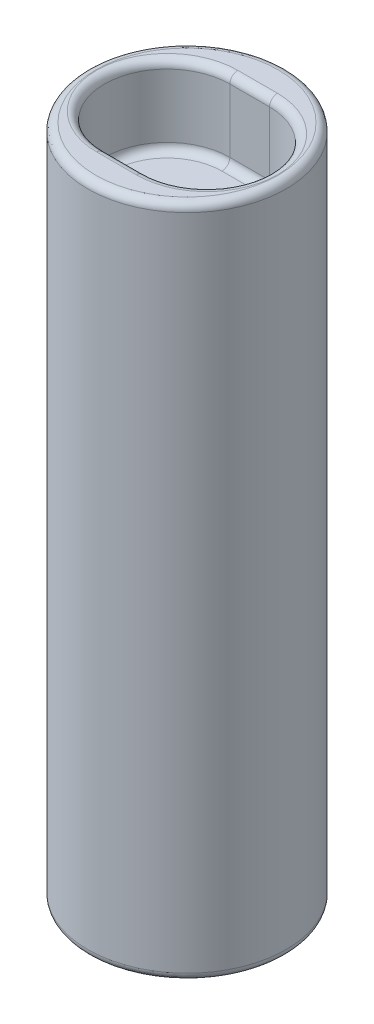
ISO-10303-21;
HEADER;
FILE_DESCRIPTION(('STEP AP214'),'2;1');
FILE_NAME('part.step','',(''),(''),'','','');
FILE_SCHEMA(('AUTOMOTIVE_DESIGN { 1 0 10303 214 1 1 1 1 }'));
ENDSEC;
DATA;
#1=APPLICATION_CONTEXT('core data for automotive mechanical design processes');
#2=APPLICATION_PROTOCOL_DEFINITION('international standard','automotive_design',2000,#1);
#3=PRODUCT_CONTEXT('',#1,'mechanical');
#4=PRODUCT('Part','Part','',(#3));
#5=PRODUCT_RELATED_PRODUCT_CATEGORY('part','',(#4));
#6=PRODUCT_DEFINITION_FORMATION('','',#4);
#7=PRODUCT_DEFINITION_CONTEXT('part definition',#1,'design');
#8=PRODUCT_DEFINITION('design','',#6,#7);
#9=PRODUCT_DEFINITION_SHAPE('','',#8);
#10=(LENGTH_UNIT() NAMED_UNIT(*) SI_UNIT(.MILLI.,.METRE.));
#11=(NAMED_UNIT(*) PLANE_ANGLE_UNIT() SI_UNIT($,.RADIAN.));
#12=(NAMED_UNIT(*) SI_UNIT($,.STERADIAN.) SOLID_ANGLE_UNIT());
#13=UNCERTAINTY_MEASURE_WITH_UNIT(LENGTH_MEASURE(1.E-05),#10,'distance_accuracy_value','');
#14=(GEOMETRIC_REPRESENTATION_CONTEXT(3) GLOBAL_UNCERTAINTY_ASSIGNED_CONTEXT((#13)) GLOBAL_UNIT_ASSIGNED_CONTEXT((#10,
#11,#12)) REPRESENTATION_CONTEXT('',''));
#15=CARTESIAN_POINT('',(0.,0.,0.));
#16=DIRECTION('',(0.,0.,1.));
#17=DIRECTION('',(1.,0.,0.));
#18=AXIS2_PLACEMENT_3D('',#15,#16,#17);
#19=CARTESIAN_POINT('',(-1.27,5.08,0.));
#20=DIRECTION('',(0.,-1.,0.));
#21=DIRECTION('',(0.,0.,-1.));
#22=AXIS2_PLACEMENT_3D('',#19,#20,#21);
#23=CYLINDRICAL_SURFACE('',#22,4.0132);
#24=DIRECTION('',(0.,-1.,0.));
#25=VECTOR('',#24,1.);
#26=CARTESIAN_POINT('',(-1.27,5.08,4.0132));
#27=LINE('',#26,#25);
#28=CARTESIAN_POINT('',(-1.27,4.572,4.0132));
#29=VERTEX_POINT('',#28);
#30=CARTESIAN_POINT('',(-1.27,0.508,4.0132));
#31=VERTEX_POINT('',#30);
#32=EDGE_CURVE('E168',#29,#31,#27,.T.);
#33=ORIENTED_EDGE('',*,*,#32,.T.);
#34=CARTESIAN_POINT('',(-1.27,0.508,0.));
#35=DIRECTION('',(0.,-1.,0.));
#36=DIRECTION('',(0.,0.,-1.));
#37=AXIS2_PLACEMENT_3D('',#34,#35,#36);
#38=CIRCLE('',#37,4.0132);
#39=CARTESIAN_POINT('',(-1.27,0.508,-4.0132));
#40=VERTEX_POINT('',#39);
#41=EDGE_CURVE('E138',#31,#40,#38,.T.);
#42=ORIENTED_EDGE('',*,*,#41,.T.);
#43=DIRECTION('',(0.,-1.,0.));
#44=VECTOR('',#43,1.);
#45=CARTESIAN_POINT('',(-1.27,5.08,-4.0132));
#46=LINE('',#45,#44);
#47=CARTESIAN_POINT('',(-1.27,4.572,-4.0132));
#48=VERTEX_POINT('',#47);
#49=EDGE_CURVE('E122',#48,#40,#46,.T.);
#50=ORIENTED_EDGE('',*,*,#49,.F.);
#51=CARTESIAN_POINT('',(-1.27,4.572,0.));
#52=DIRECTION('',(0.,1.,0.));
#53=DIRECTION('',(0.,0.,1.));
#54=AXIS2_PLACEMENT_3D('',#51,#52,#53);
#55=CIRCLE('',#54,4.0132);
#56=EDGE_CURVE('E136',#48,#29,#55,.T.);
#57=ORIENTED_EDGE('',*,*,#56,.T.);
#58=EDGE_LOOP('',(#33,#42,#50,#57));
#59=FACE_BOUND('',#58,.T.);
#60=ADVANCED_FACE('F33',(#59),#23,.F.);
#61=CARTESIAN_POINT('',(0.,5.08,-4.0132));
#62=DIRECTION('',(0.,0.,-1.));
#63=DIRECTION('',(-1.,0.,0.));
#64=AXIS2_PLACEMENT_3D('',#61,#62,#63);
#65=PLANE('',#64);
#66=ORIENTED_EDGE('',*,*,#49,.T.);
#67=DIRECTION('',(1.,0.,0.));
#68=VECTOR('',#67,1.);
#69=CARTESIAN_POINT('',(1.27,0.508,-4.0132));
#70=LINE('',#69,#68);
#71=CARTESIAN_POINT('',(1.27,0.508,-4.0132));
#72=VERTEX_POINT('',#71);
#73=EDGE_CURVE('E142',#40,#72,#70,.T.);
#74=ORIENTED_EDGE('',*,*,#73,.T.);
#75=DIRECTION('',(0.,-1.,0.));
#76=VECTOR('',#75,1.);
#77=CARTESIAN_POINT('',(1.27,5.08,-4.0132));
#78=LINE('',#77,#76);
#79=CARTESIAN_POINT('',(1.27,4.572,-4.0132));
#80=VERTEX_POINT('',#79);
#81=EDGE_CURVE('E201',#80,#72,#78,.T.);
#82=ORIENTED_EDGE('',*,*,#81,.F.);
#83=DIRECTION('',(1.,0.,0.));
#84=VECTOR('',#83,1.);
#85=CARTESIAN_POINT('',(-1.27,4.572,-4.0132));
#86=LINE('',#85,#84);
#87=EDGE_CURVE('E140',#80,#48,#86,.F.);
#88=ORIENTED_EDGE('',*,*,#87,.T.);
#89=EDGE_LOOP('',(#66,#74,#82,#88));
#90=FACE_BOUND('',#89,.T.);
#91=ADVANCED_FACE('F217',(#90),#65,.F.);
#92=CARTESIAN_POINT('',(1.27,5.08,0.));
#93=DIRECTION('',(0.,-1.,0.));
#94=DIRECTION('',(0.,0.,-1.));
#95=AXIS2_PLACEMENT_3D('',#92,#93,#94);
#96=CYLINDRICAL_SURFACE('',#95,4.0132);
#97=ORIENTED_EDGE('',*,*,#81,.T.);
#98=CARTESIAN_POINT('',(1.27,0.508,0.));
#99=DIRECTION('',(0.,-1.,0.));
#100=DIRECTION('',(0.,0.,-1.));
#101=AXIS2_PLACEMENT_3D('',#98,#99,#100);
#102=CIRCLE('',#101,4.0132);
#103=CARTESIAN_POINT('',(1.27,0.508,4.0132));
#104=VERTEX_POINT('',#103);
#105=EDGE_CURVE('E156',#72,#104,#102,.T.);
#106=ORIENTED_EDGE('',*,*,#105,.T.);
#107=DIRECTION('',(0.,-1.,0.));
#108=VECTOR('',#107,1.);
#109=CARTESIAN_POINT('',(1.27,5.08,4.0132));
#110=LINE('',#109,#108);
#111=CARTESIAN_POINT('',(1.27,4.572,4.0132));
#112=VERTEX_POINT('',#111);
#113=EDGE_CURVE('E198',#112,#104,#110,.T.);
#114=ORIENTED_EDGE('',*,*,#113,.F.);
#115=CARTESIAN_POINT('',(1.27,4.572,0.));
#116=DIRECTION('',(0.,1.,0.));
#117=DIRECTION('',(0.,0.,1.));
#118=AXIS2_PLACEMENT_3D('',#115,#116,#117);
#119=CIRCLE('',#118,4.0132);
#120=EDGE_CURVE('E154',#112,#80,#119,.T.);
#121=ORIENTED_EDGE('',*,*,#120,.T.);
#122=EDGE_LOOP('',(#97,#106,#114,#121));
#123=FACE_BOUND('',#122,.T.);
#124=ADVANCED_FACE('F200',(#123),#96,.F.);
#125=CARTESIAN_POINT('',(0.,5.08,4.0132));
#126=DIRECTION('',(0.,0.,-1.));
#127=DIRECTION('',(-1.,0.,0.));
#128=AXIS2_PLACEMENT_3D('',#125,#126,#127);
#129=PLANE('',#128);
#130=ORIENTED_EDGE('',*,*,#113,.T.);
#131=DIRECTION('',(1.,0.,0.));
#132=VECTOR('',#131,1.);
#133=CARTESIAN_POINT('',(0.,0.508,4.0132));
#134=LINE('',#133,#132);
#135=EDGE_CURVE('E109',#104,#31,#134,.F.);
#136=ORIENTED_EDGE('',*,*,#135,.T.);
#137=ORIENTED_EDGE('',*,*,#32,.F.);
#138=DIRECTION('',(1.,0.,0.));
#139=VECTOR('',#138,1.);
#140=CARTESIAN_POINT('',(0.,4.572,4.0132));
#141=LINE('',#140,#139);
#142=EDGE_CURVE('E128',#29,#112,#141,.T.);
#143=ORIENTED_EDGE('',*,*,#142,.T.);
#144=EDGE_LOOP('',(#130,#136,#137,#143));
#145=FACE_BOUND('',#144,.T.);
#146=ADVANCED_FACE('F197',(#145),#129,.T.);
#147=CARTESIAN_POINT('',(0.,5.08,0.));
#148=DIRECTION('',(0.,-1.,0.));
#149=DIRECTION('',(0.,0.,-1.));
#150=AXIS2_PLACEMENT_3D('',#147,#148,#149);
#151=CYLINDRICAL_SURFACE('',#150,6.35);
#152=CARTESIAN_POINT('',(0.,4.572,0.));
#153=DIRECTION('',(0.,1.,0.));
#154=DIRECTION('',(0.,0.,1.));
#155=AXIS2_PLACEMENT_3D('',#152,#153,#154);
#156=CIRCLE('',#155,6.35);
#157=CARTESIAN_POINT('',(0.,4.572,6.35));
#158=VERTEX_POINT('',#157);
#159=EDGE_CURVE('E42',#158,#158,#156,.F.);
#160=ORIENTED_EDGE('',*,*,#159,.T.);
#161=EDGE_LOOP('',(#160));
#162=FACE_BOUND('',#161,.T.);
#163=CARTESIAN_POINT('',(0.,-37.592,0.));
#164=DIRECTION('',(0.,-1.,0.));
#165=DIRECTION('',(0.,0.,-1.));
#166=AXIS2_PLACEMENT_3D('',#163,#164,#165);
#167=CIRCLE('',#166,6.35);
#168=CARTESIAN_POINT('',(0.,-37.592,-6.35));
#169=VERTEX_POINT('',#168);
#170=EDGE_CURVE('E158',#169,#169,#167,.F.);
#171=ORIENTED_EDGE('',*,*,#170,.T.);
#172=EDGE_LOOP('',(#171));
#173=FACE_BOUND('',#172,.T.);
#174=ADVANCED_FACE('F255',(#162,#173),#151,.T.);
#175=CARTESIAN_POINT('',(0.,5.08,0.));
#176=DIRECTION('',(0.,1.,0.));
#177=DIRECTION('',(0.,0.,1.));
#178=AXIS2_PLACEMENT_3D('',#175,#176,#177);
#179=PLANE('',#178);
#180=CARTESIAN_POINT('',(1.27,5.08,0.));
#181=DIRECTION('',(0.,1.,0.));
#182=DIRECTION('',(0.,0.,1.));
#183=AXIS2_PLACEMENT_3D('',#180,#181,#182);
#184=CIRCLE('',#183,4.5212);
#185=CARTESIAN_POINT('',(1.27,5.08,-4.5212));
#186=VERTEX_POINT('',#185);
#187=CARTESIAN_POINT('',(1.27,5.08,4.5212));
#188=VERTEX_POINT('',#187);
#189=EDGE_CURVE('E147',#186,#188,#184,.F.);
#190=ORIENTED_EDGE('',*,*,#189,.T.);
#191=DIRECTION('',(1.,0.,0.));
#192=VECTOR('',#191,1.);
#193=CARTESIAN_POINT('',(0.,5.08,4.5212));
#194=LINE('',#193,#192);
#195=CARTESIAN_POINT('',(-1.27,5.08,4.5212));
#196=VERTEX_POINT('',#195);
#197=EDGE_CURVE('E152',#188,#196,#194,.F.);
#198=ORIENTED_EDGE('',*,*,#197,.T.);
#199=CARTESIAN_POINT('',(-1.27,5.08,0.));
#200=DIRECTION('',(0.,1.,0.));
#201=DIRECTION('',(0.,0.,1.));
#202=AXIS2_PLACEMENT_3D('',#199,#200,#201);
#203=CIRCLE('',#202,4.5212);
#204=CARTESIAN_POINT('',(-1.27,5.08,-4.5212));
#205=VERTEX_POINT('',#204);
#206=EDGE_CURVE('E57',#196,#205,#203,.F.);
#207=ORIENTED_EDGE('',*,*,#206,.T.);
#208=DIRECTION('',(1.,0.,0.));
#209=VECTOR('',#208,1.);
#210=CARTESIAN_POINT('',(1.27,5.08,-4.5212));
#211=LINE('',#210,#209);
#212=EDGE_CURVE('E149',#205,#186,#211,.T.);
#213=ORIENTED_EDGE('',*,*,#212,.T.);
#214=EDGE_LOOP('',(#190,#198,#207,#213));
#215=FACE_BOUND('',#214,.T.);
#216=CARTESIAN_POINT('',(0.,5.08,0.));
#217=DIRECTION('',(0.,1.,0.));
#218=DIRECTION('',(0.,0.,1.));
#219=AXIS2_PLACEMENT_3D('',#216,#217,#218);
#220=CIRCLE('',#219,5.842);
#221=CARTESIAN_POINT('',(0.,5.08,5.842));
#222=VERTEX_POINT('',#221);
#223=EDGE_CURVE('E144',#222,#222,#220,.T.);
#224=ORIENTED_EDGE('',*,*,#223,.T.);
#225=EDGE_LOOP('',(#224));
#226=FACE_BOUND('',#225,.T.);
#227=ADVANCED_FACE('F185',(#215,#226),#179,.T.);
#228=CARTESIAN_POINT('',(0.,0.,0.));
#229=DIRECTION('',(0.,-1.,0.));
#230=DIRECTION('',(0.,0.,-1.));
#231=AXIS2_PLACEMENT_3D('',#228,#229,#230);
#232=PLANE('',#231);
#233=CARTESIAN_POINT('',(-1.27,0.,0.));
#234=DIRECTION('',(0.,-1.,0.));
#235=DIRECTION('',(0.,0.,-1.));
#236=AXIS2_PLACEMENT_3D('',#233,#234,#235);
#237=CIRCLE('',#236,3.5052);
#238=CARTESIAN_POINT('',(-1.27,0.,-3.5052));
#239=VERTEX_POINT('',#238);
#240=CARTESIAN_POINT('',(-1.27,0.,3.5052));
#241=VERTEX_POINT('',#240);
#242=EDGE_CURVE('E126',#239,#241,#237,.F.);
#243=ORIENTED_EDGE('',*,*,#242,.T.);
#244=DIRECTION('',(1.,0.,0.));
#245=VECTOR('',#244,1.);
#246=CARTESIAN_POINT('',(0.,0.,3.5052));
#247=LINE('',#246,#245);
#248=CARTESIAN_POINT('',(1.27,0.,3.5052));
#249=VERTEX_POINT('',#248);
#250=EDGE_CURVE('E107',#241,#249,#247,.T.);
#251=ORIENTED_EDGE('',*,*,#250,.T.);
#252=CARTESIAN_POINT('',(1.27,0.,0.));
#253=DIRECTION('',(0.,-1.,0.));
#254=DIRECTION('',(0.,0.,-1.));
#255=AXIS2_PLACEMENT_3D('',#252,#253,#254);
#256=CIRCLE('',#255,3.5052);
#257=CARTESIAN_POINT('',(1.27,0.,-3.5052));
#258=VERTEX_POINT('',#257);
#259=EDGE_CURVE('E115',#249,#258,#256,.F.);
#260=ORIENTED_EDGE('',*,*,#259,.T.);
#261=DIRECTION('',(1.,0.,0.));
#262=VECTOR('',#261,1.);
#263=CARTESIAN_POINT('',(-1.27,0.,-3.5052));
#264=LINE('',#263,#262);
#265=EDGE_CURVE('E121',#258,#239,#264,.F.);
#266=ORIENTED_EDGE('',*,*,#265,.T.);
#267=EDGE_LOOP('',(#243,#251,#260,#266));
#268=FACE_BOUND('',#267,.T.);
#269=ADVANCED_FACE('F124',(#268),#232,.F.);
#270=CARTESIAN_POINT('',(0.,-38.1,0.));
#271=DIRECTION('',(0.,-1.,0.));
#272=DIRECTION('',(0.,0.,-1.));
#273=AXIS2_PLACEMENT_3D('',#270,#271,#272);
#274=PLANE('',#273);
#275=CARTESIAN_POINT('',(0.,-38.1,0.));
#276=DIRECTION('',(0.,-1.,0.));
#277=DIRECTION('',(0.,0.,-1.));
#278=AXIS2_PLACEMENT_3D('',#275,#276,#277);
#279=CIRCLE('',#278,5.842);
#280=CARTESIAN_POINT('',(0.,-38.1,-5.842));
#281=VERTEX_POINT('',#280);
#282=EDGE_CURVE('E11',#281,#281,#279,.T.);
#283=ORIENTED_EDGE('',*,*,#282,.T.);
#284=EDGE_LOOP('',(#283));
#285=FACE_BOUND('',#284,.T.);
#286=ADVANCED_FACE('F236',(#285),#274,.T.);
#287=CARTESIAN_POINT('',(0.,0.508,-3.5052));
#288=DIRECTION('',(-1.,0.,0.));
#289=DIRECTION('',(0.,0.,1.));
#290=AXIS2_PLACEMENT_3D('',#287,#288,#289);
#291=CYLINDRICAL_SURFACE('',#290,0.508);
#292=CARTESIAN_POINT('',(1.27,0.508,-3.5052));
#293=DIRECTION('',(-1.,0.,0.));
#294=DIRECTION('',(0.,0.,1.));
#295=AXIS2_PLACEMENT_3D('',#292,#293,#294);
#296=CIRCLE('',#295,0.508);
#297=EDGE_CURVE('E118',#72,#258,#296,.T.);
#298=ORIENTED_EDGE('',*,*,#297,.F.);
#299=ORIENTED_EDGE('',*,*,#73,.F.);
#300=CARTESIAN_POINT('',(-1.27,0.508,-3.5052));
#301=DIRECTION('',(1.,0.,0.));
#302=DIRECTION('',(0.,0.,-1.));
#303=AXIS2_PLACEMENT_3D('',#300,#301,#302);
#304=CIRCLE('',#303,0.508);
#305=EDGE_CURVE('E165',#239,#40,#304,.T.);
#306=ORIENTED_EDGE('',*,*,#305,.F.);
#307=ORIENTED_EDGE('',*,*,#265,.F.);
#308=EDGE_LOOP('',(#298,#299,#306,#307));
#309=FACE_BOUND('',#308,.T.);
#310=ADVANCED_FACE('F210',(#309),#291,.F.);
#311=CARTESIAN_POINT('',(-1.27,0.508,0.));
#312=DIRECTION('',(0.,-1.,0.));
#313=DIRECTION('',(0.,0.,-1.));
#314=AXIS2_PLACEMENT_3D('',#311,#312,#313);
#315=TOROIDAL_SURFACE('',#314,3.5052,0.508);
#316=ORIENTED_EDGE('',*,*,#305,.T.);
#317=ORIENTED_EDGE('',*,*,#41,.F.);
#318=CARTESIAN_POINT('',(-1.27,0.508,3.5052));
#319=DIRECTION('',(-1.,0.,0.));
#320=DIRECTION('',(0.,0.,1.));
#321=AXIS2_PLACEMENT_3D('',#318,#319,#320);
#322=CIRCLE('',#321,0.508);
#323=EDGE_CURVE('E112',#241,#31,#322,.T.);
#324=ORIENTED_EDGE('',*,*,#323,.F.);
#325=ORIENTED_EDGE('',*,*,#242,.F.);
#326=EDGE_LOOP('',(#316,#317,#324,#325));
#327=FACE_BOUND('',#326,.T.);
#328=ADVANCED_FACE('F213',(#327),#315,.F.);
#329=CARTESIAN_POINT('',(1.27,0.508,0.));
#330=DIRECTION('',(0.,-1.,0.));
#331=DIRECTION('',(0.,0.,-1.));
#332=AXIS2_PLACEMENT_3D('',#329,#330,#331);
#333=TOROIDAL_SURFACE('',#332,3.5052,0.508);
#334=ORIENTED_EDGE('',*,*,#297,.T.);
#335=ORIENTED_EDGE('',*,*,#259,.F.);
#336=CARTESIAN_POINT('',(1.27,0.508,3.5052));
#337=DIRECTION('',(1.,0.,0.));
#338=DIRECTION('',(0.,0.,-1.));
#339=AXIS2_PLACEMENT_3D('',#336,#337,#338);
#340=CIRCLE('',#339,0.508);
#341=EDGE_CURVE('E103',#104,#249,#340,.T.);
#342=ORIENTED_EDGE('',*,*,#341,.F.);
#343=ORIENTED_EDGE('',*,*,#105,.F.);
#344=EDGE_LOOP('',(#334,#335,#342,#343));
#345=FACE_BOUND('',#344,.T.);
#346=ADVANCED_FACE('F116',(#345),#333,.F.);
#347=CARTESIAN_POINT('',(0.,0.508,3.5052));
#348=DIRECTION('',(1.,0.,0.));
#349=DIRECTION('',(0.,0.,-1.));
#350=AXIS2_PLACEMENT_3D('',#347,#348,#349);
#351=CYLINDRICAL_SURFACE('',#350,0.508);
#352=ORIENTED_EDGE('',*,*,#323,.T.);
#353=ORIENTED_EDGE('',*,*,#135,.F.);
#354=ORIENTED_EDGE('',*,*,#341,.T.);
#355=ORIENTED_EDGE('',*,*,#250,.F.);
#356=EDGE_LOOP('',(#352,#353,#354,#355));
#357=FACE_BOUND('',#356,.T.);
#358=ADVANCED_FACE('F105',(#357),#351,.F.);
#359=CARTESIAN_POINT('',(0.,4.572,-4.5212));
#360=DIRECTION('',(-1.,0.,0.));
#361=DIRECTION('',(0.,0.,1.));
#362=AXIS2_PLACEMENT_3D('',#359,#360,#361);
#363=CYLINDRICAL_SURFACE('',#362,0.508);
#364=CARTESIAN_POINT('',(1.27,4.572,-4.5212));
#365=DIRECTION('',(1.,0.,0.));
#366=DIRECTION('',(0.,0.,-1.));
#367=AXIS2_PLACEMENT_3D('',#364,#365,#366);
#368=CIRCLE('',#367,0.508);
#369=EDGE_CURVE('E171',#186,#80,#368,.T.);
#370=ORIENTED_EDGE('',*,*,#369,.F.);
#371=ORIENTED_EDGE('',*,*,#212,.F.);
#372=CARTESIAN_POINT('',(-1.27,4.572,-4.5212));
#373=DIRECTION('',(-1.,0.,0.));
#374=DIRECTION('',(0.,0.,1.));
#375=AXIS2_PLACEMENT_3D('',#372,#373,#374);
#376=CIRCLE('',#375,0.508);
#377=EDGE_CURVE('E37',#48,#205,#376,.T.);
#378=ORIENTED_EDGE('',*,*,#377,.F.);
#379=ORIENTED_EDGE('',*,*,#87,.F.);
#380=EDGE_LOOP('',(#370,#371,#378,#379));
#381=FACE_BOUND('',#380,.T.);
#382=ADVANCED_FACE('F184',(#381),#363,.T.);
#383=CARTESIAN_POINT('',(-1.27,4.572,0.));
#384=DIRECTION('',(0.,1.,0.));
#385=DIRECTION('',(0.,0.,1.));
#386=AXIS2_PLACEMENT_3D('',#383,#384,#385);
#387=TOROIDAL_SURFACE('',#386,4.5212,0.508);
#388=ORIENTED_EDGE('',*,*,#377,.T.);
#389=ORIENTED_EDGE('',*,*,#206,.F.);
#390=CARTESIAN_POINT('',(-1.27,4.572,4.5212));
#391=DIRECTION('',(1.,0.,0.));
#392=DIRECTION('',(0.,0.,-1.));
#393=AXIS2_PLACEMENT_3D('',#390,#391,#392);
#394=CIRCLE('',#393,0.508);
#395=EDGE_CURVE('E50',#29,#196,#394,.T.);
#396=ORIENTED_EDGE('',*,*,#395,.F.);
#397=ORIENTED_EDGE('',*,*,#56,.F.);
#398=EDGE_LOOP('',(#388,#389,#396,#397));
#399=FACE_BOUND('',#398,.T.);
#400=ADVANCED_FACE('F181',(#399),#387,.T.);
#401=CARTESIAN_POINT('',(1.27,4.572,0.));
#402=DIRECTION('',(0.,1.,0.));
#403=DIRECTION('',(0.,0.,1.));
#404=AXIS2_PLACEMENT_3D('',#401,#402,#403);
#405=TOROIDAL_SURFACE('',#404,4.5212,0.508);
#406=ORIENTED_EDGE('',*,*,#369,.T.);
#407=ORIENTED_EDGE('',*,*,#120,.F.);
#408=CARTESIAN_POINT('',(1.27,4.572,4.5212));
#409=DIRECTION('',(-1.,0.,0.));
#410=DIRECTION('',(0.,0.,1.));
#411=AXIS2_PLACEMENT_3D('',#408,#409,#410);
#412=CIRCLE('',#411,0.508);
#413=EDGE_CURVE('E169',#188,#112,#412,.T.);
#414=ORIENTED_EDGE('',*,*,#413,.F.);
#415=ORIENTED_EDGE('',*,*,#189,.F.);
#416=EDGE_LOOP('',(#406,#407,#414,#415));
#417=FACE_BOUND('',#416,.T.);
#418=ADVANCED_FACE('F189',(#417),#405,.T.);
#419=CARTESIAN_POINT('',(0.,4.572,4.5212));
#420=DIRECTION('',(1.,0.,0.));
#421=DIRECTION('',(0.,0.,-1.));
#422=AXIS2_PLACEMENT_3D('',#419,#420,#421);
#423=CYLINDRICAL_SURFACE('',#422,0.508);
#424=ORIENTED_EDGE('',*,*,#395,.T.);
#425=ORIENTED_EDGE('',*,*,#197,.F.);
#426=ORIENTED_EDGE('',*,*,#413,.T.);
#427=ORIENTED_EDGE('',*,*,#142,.F.);
#428=EDGE_LOOP('',(#424,#425,#426,#427));
#429=FACE_BOUND('',#428,.T.);
#430=ADVANCED_FACE('F188',(#429),#423,.T.);
#431=CARTESIAN_POINT('',(0.,4.572,0.));
#432=DIRECTION('',(0.,1.,0.));
#433=DIRECTION('',(0.,0.,1.));
#434=AXIS2_PLACEMENT_3D('',#431,#432,#433);
#435=TOROIDAL_SURFACE('',#434,5.842,0.508);
#436=ORIENTED_EDGE('',*,*,#159,.F.);
#437=EDGE_LOOP('',(#436));
#438=FACE_BOUND('',#437,.T.);
#439=ORIENTED_EDGE('',*,*,#223,.F.);
#440=EDGE_LOOP('',(#439));
#441=FACE_BOUND('',#440,.T.);
#442=ADVANCED_FACE('F239',(#438,#441),#435,.T.);
#443=CARTESIAN_POINT('',(0.,-37.592,0.));
#444=DIRECTION('',(0.,-1.,0.));
#445=DIRECTION('',(0.,0.,-1.));
#446=AXIS2_PLACEMENT_3D('',#443,#444,#445);
#447=TOROIDAL_SURFACE('',#446,5.842,0.508);
#448=ORIENTED_EDGE('',*,*,#170,.F.);
#449=EDGE_LOOP('',(#448));
#450=FACE_BOUND('',#449,.T.);
#451=ORIENTED_EDGE('',*,*,#282,.F.);
#452=EDGE_LOOP('',(#451));
#453=FACE_BOUND('',#452,.T.);
#454=ADVANCED_FACE('F35',(#450,#453),#447,.T.);
#455=CLOSED_SHELL('',(#60,#91,#124,#146,#174,#227,#269,#286,#310,#328,#346,#358,#382,#400,#418,
#430,#442,#454));
#456=MANIFOLD_SOLID_BREP('B2',#455);
#457=ADVANCED_BREP_SHAPE_REPRESENTATION('',(#18,#456),#14);
#458=SHAPE_DEFINITION_REPRESENTATION(#9,#457);
ENDSEC;
END-ISO-10303-21;
